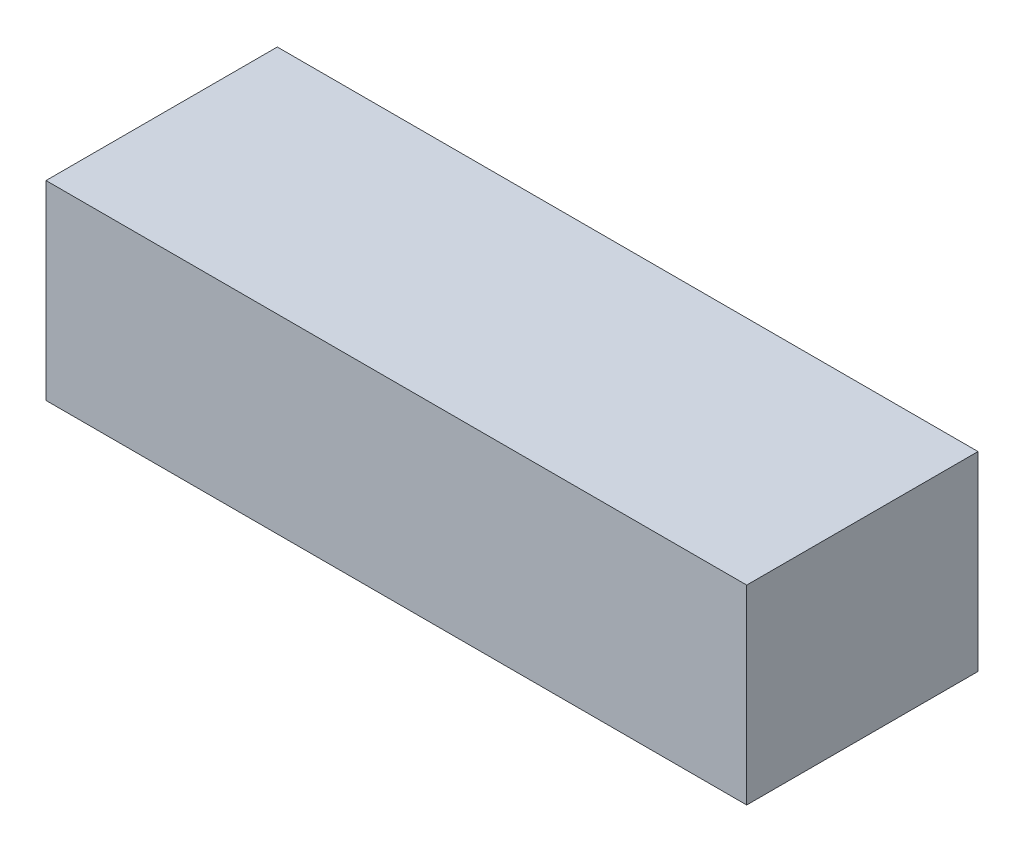
ISO-10303-21;
HEADER;
FILE_DESCRIPTION(('STEP AP214'),'2;1');
FILE_NAME('part.step','',(''),(''),'','','');
FILE_SCHEMA(('AUTOMOTIVE_DESIGN { 1 0 10303 214 1 1 1 1 }'));
ENDSEC;
DATA;
#1=APPLICATION_CONTEXT('core data for automotive mechanical design processes');
#2=APPLICATION_PROTOCOL_DEFINITION('international standard','automotive_design',2000,#1);
#3=PRODUCT_CONTEXT('',#1,'mechanical');
#4=PRODUCT('Part','Part','',(#3));
#5=PRODUCT_RELATED_PRODUCT_CATEGORY('part','',(#4));
#6=PRODUCT_DEFINITION_FORMATION('','',#4);
#7=PRODUCT_DEFINITION_CONTEXT('part definition',#1,'design');
#8=PRODUCT_DEFINITION('design','',#6,#7);
#9=PRODUCT_DEFINITION_SHAPE('','',#8);
#10=(LENGTH_UNIT() NAMED_UNIT(*) SI_UNIT(.MILLI.,.METRE.));
#11=(NAMED_UNIT(*) PLANE_ANGLE_UNIT() SI_UNIT($,.RADIAN.));
#12=(NAMED_UNIT(*) SI_UNIT($,.STERADIAN.) SOLID_ANGLE_UNIT());
#13=UNCERTAINTY_MEASURE_WITH_UNIT(LENGTH_MEASURE(1.E-05),#10,'distance_accuracy_value','');
#14=(GEOMETRIC_REPRESENTATION_CONTEXT(3) GLOBAL_UNCERTAINTY_ASSIGNED_CONTEXT((#13)) GLOBAL_UNIT_ASSIGNED_CONTEXT((#10,
#11,#12)) REPRESENTATION_CONTEXT('',''));
#15=CARTESIAN_POINT('',(0.,0.,0.));
#16=DIRECTION('',(0.,0.,1.));
#17=DIRECTION('',(1.,0.,0.));
#18=AXIS2_PLACEMENT_3D('',#15,#16,#17);
#19=CARTESIAN_POINT('',(51.5,28.,17.));
#20=DIRECTION('',(-1.,0.,0.));
#21=DIRECTION('',(0.,0.,1.));
#22=AXIS2_PLACEMENT_3D('',#19,#20,#21);
#23=PLANE('',#22);
#24=DIRECTION('',(0.,0.,-1.));
#25=VECTOR('',#24,1.);
#26=CARTESIAN_POINT('',(51.5,0.,17.));
#27=LINE('',#26,#25);
#28=CARTESIAN_POINT('',(51.5,0.,17.));
#29=VERTEX_POINT('',#28);
#30=CARTESIAN_POINT('',(51.5,0.,-17.));
#31=VERTEX_POINT('',#30);
#32=EDGE_CURVE('E100',#29,#31,#27,.T.);
#33=ORIENTED_EDGE('',*,*,#32,.T.);
#34=DIRECTION('',(0.,-1.,0.));
#35=VECTOR('',#34,1.);
#36=CARTESIAN_POINT('',(51.5,28.,-17.));
#37=LINE('',#36,#35);
#38=CARTESIAN_POINT('',(51.5,28.,-17.));
#39=VERTEX_POINT('',#38);
#40=EDGE_CURVE('E11',#39,#31,#37,.T.);
#41=ORIENTED_EDGE('',*,*,#40,.F.);
#42=DIRECTION('',(0.,0.,-1.));
#43=VECTOR('',#42,1.);
#44=CARTESIAN_POINT('',(51.5,28.,17.));
#45=LINE('',#44,#43);
#46=CARTESIAN_POINT('',(51.5,28.,17.));
#47=VERTEX_POINT('',#46);
#48=EDGE_CURVE('E88',#47,#39,#45,.T.);
#49=ORIENTED_EDGE('',*,*,#48,.F.);
#50=DIRECTION('',(0.,-1.,0.));
#51=VECTOR('',#50,1.);
#52=CARTESIAN_POINT('',(51.5,28.,17.));
#53=LINE('',#52,#51);
#54=EDGE_CURVE('E96',#47,#29,#53,.T.);
#55=ORIENTED_EDGE('',*,*,#54,.T.);
#56=EDGE_LOOP('',(#33,#41,#49,#55));
#57=FACE_BOUND('',#56,.T.);
#58=ADVANCED_FACE('F37',(#57),#23,.F.);
#59=CARTESIAN_POINT('',(-51.5,28.,-17.));
#60=DIRECTION('',(0.,0.,1.));
#61=DIRECTION('',(1.,0.,0.));
#62=AXIS2_PLACEMENT_3D('',#59,#60,#61);
#63=PLANE('',#62);
#64=DIRECTION('',(-1.,0.,0.));
#65=VECTOR('',#64,1.);
#66=CARTESIAN_POINT('',(-51.5,0.,-17.));
#67=LINE('',#66,#65);
#68=CARTESIAN_POINT('',(-51.5,0.,-17.));
#69=VERTEX_POINT('',#68);
#70=EDGE_CURVE('E92',#31,#69,#67,.T.);
#71=ORIENTED_EDGE('',*,*,#70,.T.);
#72=DIRECTION('',(0.,-1.,0.));
#73=VECTOR('',#72,1.);
#74=CARTESIAN_POINT('',(-51.5,28.,-17.));
#75=LINE('',#74,#73);
#76=CARTESIAN_POINT('',(-51.5,28.,-17.));
#77=VERTEX_POINT('',#76);
#78=EDGE_CURVE('E45',#77,#69,#75,.T.);
#79=ORIENTED_EDGE('',*,*,#78,.F.);
#80=DIRECTION('',(-1.,0.,0.));
#81=VECTOR('',#80,1.);
#82=CARTESIAN_POINT('',(-51.5,28.,-17.));
#83=LINE('',#82,#81);
#84=EDGE_CURVE('E83',#39,#77,#83,.T.);
#85=ORIENTED_EDGE('',*,*,#84,.F.);
#86=ORIENTED_EDGE('',*,*,#40,.T.);
#87=EDGE_LOOP('',(#71,#79,#85,#86));
#88=FACE_BOUND('',#87,.T.);
#89=ADVANCED_FACE('F91',(#88),#63,.F.);
#90=CARTESIAN_POINT('',(-51.5,28.,17.));
#91=DIRECTION('',(1.,0.,0.));
#92=DIRECTION('',(0.,0.,-1.));
#93=AXIS2_PLACEMENT_3D('',#90,#91,#92);
#94=PLANE('',#93);
#95=DIRECTION('',(0.,0.,1.));
#96=VECTOR('',#95,1.);
#97=CARTESIAN_POINT('',(-51.5,0.,17.));
#98=LINE('',#97,#96);
#99=CARTESIAN_POINT('',(-51.5,0.,17.));
#100=VERTEX_POINT('',#99);
#101=EDGE_CURVE('E70',#69,#100,#98,.T.);
#102=ORIENTED_EDGE('',*,*,#101,.T.);
#103=DIRECTION('',(0.,-1.,0.));
#104=VECTOR('',#103,1.);
#105=CARTESIAN_POINT('',(-51.5,28.,17.));
#106=LINE('',#105,#104);
#107=CARTESIAN_POINT('',(-51.5,28.,17.));
#108=VERTEX_POINT('',#107);
#109=EDGE_CURVE('E93',#108,#100,#106,.T.);
#110=ORIENTED_EDGE('',*,*,#109,.F.);
#111=DIRECTION('',(0.,0.,1.));
#112=VECTOR('',#111,1.);
#113=CARTESIAN_POINT('',(-51.5,28.,17.));
#114=LINE('',#113,#112);
#115=EDGE_CURVE('E86',#77,#108,#114,.T.);
#116=ORIENTED_EDGE('',*,*,#115,.F.);
#117=ORIENTED_EDGE('',*,*,#78,.T.);
#118=EDGE_LOOP('',(#102,#110,#116,#117));
#119=FACE_BOUND('',#118,.T.);
#120=ADVANCED_FACE('F94',(#119),#94,.F.);
#121=CARTESIAN_POINT('',(-51.5,28.,17.));
#122=DIRECTION('',(0.,0.,-1.));
#123=DIRECTION('',(-1.,0.,0.));
#124=AXIS2_PLACEMENT_3D('',#121,#122,#123);
#125=PLANE('',#124);
#126=DIRECTION('',(1.,0.,0.));
#127=VECTOR('',#126,1.);
#128=CARTESIAN_POINT('',(-51.5,0.,17.));
#129=LINE('',#128,#127);
#130=EDGE_CURVE('E76',#100,#29,#129,.T.);
#131=ORIENTED_EDGE('',*,*,#130,.T.);
#132=ORIENTED_EDGE('',*,*,#54,.F.);
#133=DIRECTION('',(1.,0.,0.));
#134=VECTOR('',#133,1.);
#135=CARTESIAN_POINT('',(-51.5,28.,17.));
#136=LINE('',#135,#134);
#137=EDGE_CURVE('E53',#108,#47,#136,.T.);
#138=ORIENTED_EDGE('',*,*,#137,.F.);
#139=ORIENTED_EDGE('',*,*,#109,.T.);
#140=EDGE_LOOP('',(#131,#132,#138,#139));
#141=FACE_BOUND('',#140,.T.);
#142=ADVANCED_FACE('F107',(#141),#125,.F.);
#143=CARTESIAN_POINT('',(0.,28.,0.));
#144=DIRECTION('',(0.,-1.,0.));
#145=DIRECTION('',(0.,0.,-1.));
#146=AXIS2_PLACEMENT_3D('',#143,#144,#145);
#147=PLANE('',#146);
#148=ORIENTED_EDGE('',*,*,#48,.T.);
#149=ORIENTED_EDGE('',*,*,#84,.T.);
#150=ORIENTED_EDGE('',*,*,#115,.T.);
#151=ORIENTED_EDGE('',*,*,#137,.T.);
#152=EDGE_LOOP('',(#148,#149,#150,#151));
#153=FACE_BOUND('',#152,.T.);
#154=ADVANCED_FACE('F84',(#153),#147,.F.);
#155=CARTESIAN_POINT('',(0.,0.,0.));
#156=DIRECTION('',(0.,-1.,0.));
#157=DIRECTION('',(0.,0.,-1.));
#158=AXIS2_PLACEMENT_3D('',#155,#156,#157);
#159=PLANE('',#158);
#160=ORIENTED_EDGE('',*,*,#32,.F.);
#161=ORIENTED_EDGE('',*,*,#130,.F.);
#162=ORIENTED_EDGE('',*,*,#101,.F.);
#163=ORIENTED_EDGE('',*,*,#70,.F.);
#164=EDGE_LOOP('',(#160,#161,#162,#163));
#165=FACE_BOUND('',#164,.T.);
#166=ADVANCED_FACE('F110',(#165),#159,.T.);
#167=CLOSED_SHELL('',(#58,#89,#120,#142,#154,#166));
#168=MANIFOLD_SOLID_BREP('B2',#167);
#169=ADVANCED_BREP_SHAPE_REPRESENTATION('',(#18,#168),#14);
#170=SHAPE_DEFINITION_REPRESENTATION(#9,#169);
ENDSEC;
END-ISO-10303-21;
